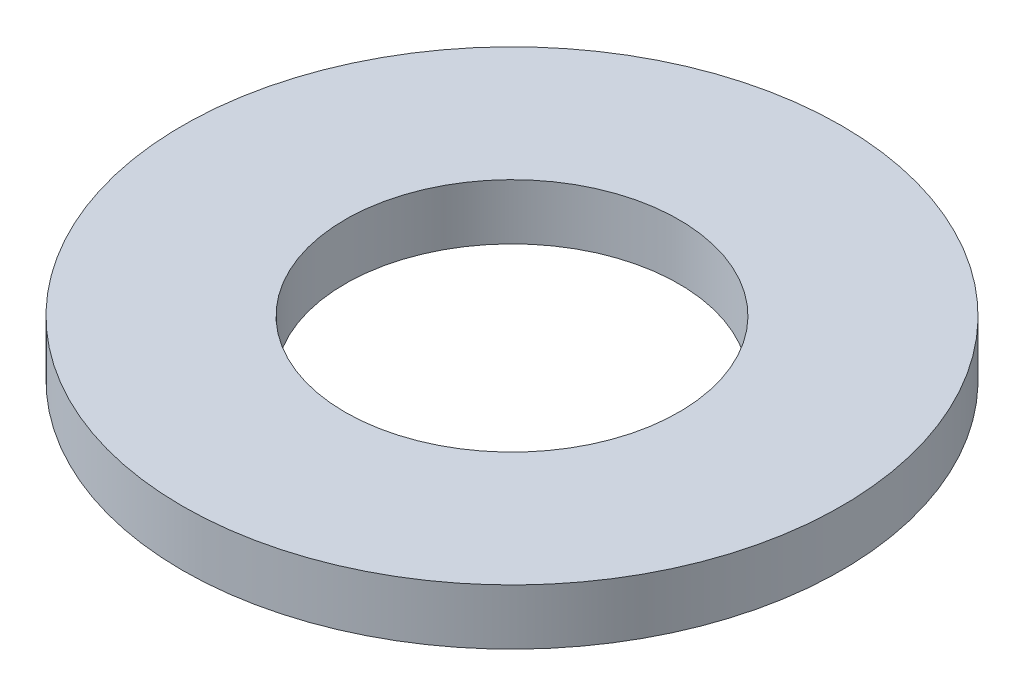
ISO-10303-21;
HEADER;
FILE_DESCRIPTION(('STEP AP214'),'2;1');
FILE_NAME('part.step','',(''),(''),'','','');
FILE_SCHEMA(('AUTOMOTIVE_DESIGN { 1 0 10303 214 1 1 1 1 }'));
ENDSEC;
DATA;
#1=APPLICATION_CONTEXT('core data for automotive mechanical design processes');
#2=APPLICATION_PROTOCOL_DEFINITION('international standard','automotive_design',2000,#1);
#3=PRODUCT_CONTEXT('',#1,'mechanical');
#4=PRODUCT('Part','Part','',(#3));
#5=PRODUCT_RELATED_PRODUCT_CATEGORY('part','',(#4));
#6=PRODUCT_DEFINITION_FORMATION('','',#4);
#7=PRODUCT_DEFINITION_CONTEXT('part definition',#1,'design');
#8=PRODUCT_DEFINITION('design','',#6,#7);
#9=PRODUCT_DEFINITION_SHAPE('','',#8);
#10=(LENGTH_UNIT() NAMED_UNIT(*) SI_UNIT(.MILLI.,.METRE.));
#11=(NAMED_UNIT(*) PLANE_ANGLE_UNIT() SI_UNIT($,.RADIAN.));
#12=(NAMED_UNIT(*) SI_UNIT($,.STERADIAN.) SOLID_ANGLE_UNIT());
#13=UNCERTAINTY_MEASURE_WITH_UNIT(LENGTH_MEASURE(1.E-05),#10,'distance_accuracy_value','');
#14=(GEOMETRIC_REPRESENTATION_CONTEXT(3) GLOBAL_UNCERTAINTY_ASSIGNED_CONTEXT((#13)) GLOBAL_UNIT_ASSIGNED_CONTEXT((#10,
#11,#12)) REPRESENTATION_CONTEXT('',''));
#15=CARTESIAN_POINT('',(0.,0.,0.));
#16=DIRECTION('',(0.,0.,1.));
#17=DIRECTION('',(1.,0.,0.));
#18=AXIS2_PLACEMENT_3D('',#15,#16,#17);
#19=CARTESIAN_POINT('',(0.,2.,0.));
#20=DIRECTION('',(0.,1.,0.));
#21=DIRECTION('',(0.,0.,1.));
#22=AXIS2_PLACEMENT_3D('',#19,#20,#21);
#23=PLANE('',#22);
#24=CARTESIAN_POINT('',(0.,2.,0.));
#25=DIRECTION('',(0.,1.,0.));
#26=DIRECTION('',(0.,0.,1.));
#27=AXIS2_PLACEMENT_3D('',#24,#25,#26);
#28=CIRCLE('',#27,11.85);
#29=CARTESIAN_POINT('',(0.,2.,11.85));
#30=VERTEX_POINT('',#29);
#31=EDGE_CURVE('E10',#30,#30,#28,.T.);
#32=ORIENTED_EDGE('',*,*,#31,.T.);
#33=EDGE_LOOP('',(#32));
#34=FACE_BOUND('',#33,.T.);
#35=CARTESIAN_POINT('',(0.,2.,0.));
#36=DIRECTION('',(0.,1.,0.));
#37=DIRECTION('',(0.,0.,1.));
#38=AXIS2_PLACEMENT_3D('',#35,#36,#37);
#39=CIRCLE('',#38,6.);
#40=CARTESIAN_POINT('',(0.,2.,6.));
#41=VERTEX_POINT('',#40);
#42=EDGE_CURVE('E48',#41,#41,#39,.T.);
#43=ORIENTED_EDGE('',*,*,#42,.F.);
#44=EDGE_LOOP('',(#43));
#45=FACE_BOUND('',#44,.T.);
#46=ADVANCED_FACE('F37',(#34,#45),#23,.T.);
#47=CARTESIAN_POINT('',(0.,0.,0.));
#48=DIRECTION('',(0.,1.,0.));
#49=DIRECTION('',(0.,0.,1.));
#50=AXIS2_PLACEMENT_3D('',#47,#48,#49);
#51=PLANE('',#50);
#52=CARTESIAN_POINT('',(0.,0.,0.));
#53=DIRECTION('',(0.,1.,0.));
#54=DIRECTION('',(0.,0.,1.));
#55=AXIS2_PLACEMENT_3D('',#52,#53,#54);
#56=CIRCLE('',#55,11.85);
#57=CARTESIAN_POINT('',(0.,0.,11.85));
#58=VERTEX_POINT('',#57);
#59=EDGE_CURVE('E41',#58,#58,#56,.T.);
#60=ORIENTED_EDGE('',*,*,#59,.F.);
#61=EDGE_LOOP('',(#60));
#62=FACE_BOUND('',#61,.T.);
#63=CARTESIAN_POINT('',(0.,0.,0.));
#64=DIRECTION('',(0.,1.,0.));
#65=DIRECTION('',(0.,0.,1.));
#66=AXIS2_PLACEMENT_3D('',#63,#64,#65);
#67=CIRCLE('',#66,6.);
#68=CARTESIAN_POINT('',(0.,0.,6.));
#69=VERTEX_POINT('',#68);
#70=EDGE_CURVE('E50',#69,#69,#67,.T.);
#71=ORIENTED_EDGE('',*,*,#70,.T.);
#72=EDGE_LOOP('',(#71));
#73=FACE_BOUND('',#72,.T.);
#74=ADVANCED_FACE('F60',(#62,#73),#51,.F.);
#75=CARTESIAN_POINT('',(0.,2.,0.));
#76=DIRECTION('',(0.,-1.,0.));
#77=DIRECTION('',(0.,0.,-1.));
#78=AXIS2_PLACEMENT_3D('',#75,#76,#77);
#79=CYLINDRICAL_SURFACE('',#78,11.85);
#80=ORIENTED_EDGE('',*,*,#31,.F.);
#81=EDGE_LOOP('',(#80));
#82=FACE_BOUND('',#81,.T.);
#83=ORIENTED_EDGE('',*,*,#59,.T.);
#84=EDGE_LOOP('',(#83));
#85=FACE_BOUND('',#84,.T.);
#86=ADVANCED_FACE('F39',(#82,#85),#79,.T.);
#87=CARTESIAN_POINT('',(0.,2.,0.));
#88=DIRECTION('',(0.,-1.,0.));
#89=DIRECTION('',(0.,0.,-1.));
#90=AXIS2_PLACEMENT_3D('',#87,#88,#89);
#91=CYLINDRICAL_SURFACE('',#90,6.);
#92=ORIENTED_EDGE('',*,*,#42,.T.);
#93=EDGE_LOOP('',(#92));
#94=FACE_BOUND('',#93,.T.);
#95=ORIENTED_EDGE('',*,*,#70,.F.);
#96=EDGE_LOOP('',(#95));
#97=FACE_BOUND('',#96,.T.);
#98=ADVANCED_FACE('F56',(#94,#97),#91,.F.);
#99=CLOSED_SHELL('',(#46,#74,#86,#98));
#100=MANIFOLD_SOLID_BREP('B2',#99);
#101=ADVANCED_BREP_SHAPE_REPRESENTATION('',(#18,#100),#14);
#102=SHAPE_DEFINITION_REPRESENTATION(#9,#101);
ENDSEC;
END-ISO-10303-21;
